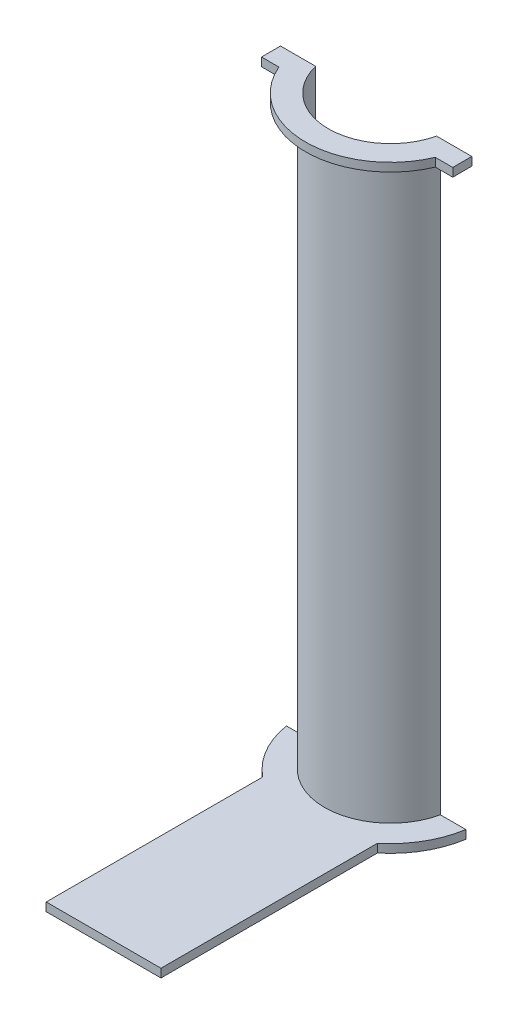
ISO-10303-21;
HEADER;
FILE_DESCRIPTION(('STEP AP214'),'2;1');
FILE_NAME('part.step','',(''),(''),'','','');
FILE_SCHEMA(('AUTOMOTIVE_DESIGN { 1 0 10303 214 1 1 1 1 }'));
ENDSEC;
DATA;
#1=APPLICATION_CONTEXT('core data for automotive mechanical design processes');
#2=APPLICATION_PROTOCOL_DEFINITION('international standard','automotive_design',2000,#1);
#3=PRODUCT_CONTEXT('',#1,'mechanical');
#4=PRODUCT('Part','Part','',(#3));
#5=PRODUCT_RELATED_PRODUCT_CATEGORY('part','',(#4));
#6=PRODUCT_DEFINITION_FORMATION('','',#4);
#7=PRODUCT_DEFINITION_CONTEXT('part definition',#1,'design');
#8=PRODUCT_DEFINITION('design','',#6,#7);
#9=PRODUCT_DEFINITION_SHAPE('','',#8);
#10=(LENGTH_UNIT() NAMED_UNIT(*) SI_UNIT(.MILLI.,.METRE.));
#11=(NAMED_UNIT(*) PLANE_ANGLE_UNIT() SI_UNIT($,.RADIAN.));
#12=(NAMED_UNIT(*) SI_UNIT($,.STERADIAN.) SOLID_ANGLE_UNIT());
#13=UNCERTAINTY_MEASURE_WITH_UNIT(LENGTH_MEASURE(1.E-05),#10,'distance_accuracy_value','');
#14=(GEOMETRIC_REPRESENTATION_CONTEXT(3) GLOBAL_UNCERTAINTY_ASSIGNED_CONTEXT((#13)) GLOBAL_UNIT_ASSIGNED_CONTEXT((#10,
#11,#12)) REPRESENTATION_CONTEXT('',''));
#15=CARTESIAN_POINT('',(0.,0.,0.));
#16=DIRECTION('',(0.,0.,1.));
#17=DIRECTION('',(1.,0.,0.));
#18=AXIS2_PLACEMENT_3D('',#15,#16,#17);
#19=CARTESIAN_POINT('',(-3.5559999999999,3.711630352635,-5.7911999999999));
#20=DIRECTION('',(0.,-1.,0.));
#21=DIRECTION('',(-1.,0.,0.));
#22=AXIS2_PLACEMENT_3D('',#19,#20,#21);
#23=CYLINDRICAL_SURFACE('',#22,0.349999999999993);
#24=CARTESIAN_POINT('',(-3.556,2.9306,-5.7911999999999));
#25=DIRECTION('',(0.,-1.,0.));
#26=DIRECTION('',(1.,0.,0.));
#27=AXIS2_PLACEMENT_3D('',#24,#25,#26);
#28=CIRCLE('',#27,0.350000000000009);
#29=CARTESIAN_POINT('',(-3.2143956089275,2.9306,-5.7149999999999));
#30=VERTEX_POINT('',#29);
#31=CARTESIAN_POINT('',(-3.8976043910725,2.9306,-5.7149999999999));
#32=VERTEX_POINT('',#31);
#33=EDGE_CURVE('E11',#30,#32,#28,.T.);
#34=ORIENTED_EDGE('',*,*,#33,.T.);
#35=DIRECTION('',(0.,-1.,0.));
#36=VECTOR('',#35,1.);
#37=CARTESIAN_POINT('',(-3.8976043910724,3.711630352635,-5.7149999999999));
#38=LINE('',#37,#36);
#39=CARTESIAN_POINT('',(-3.8976043910724,-0.1366,-5.7149999999999));
#40=VERTEX_POINT('',#39);
#41=EDGE_CURVE('E24',#32,#40,#38,.T.);
#42=ORIENTED_EDGE('',*,*,#41,.T.);
#43=CARTESIAN_POINT('',(-3.5559999999999,-0.1366,-5.7911999999999));
#44=DIRECTION('',(0.,-1.,0.));
#45=DIRECTION('',(1.,0.,0.));
#46=AXIS2_PLACEMENT_3D('',#43,#44,#45);
#47=CIRCLE('',#46,0.349999999999994);
#48=CARTESIAN_POINT('',(-3.2143956089274,-0.1366,-5.715));
#49=VERTEX_POINT('',#48);
#50=EDGE_CURVE('E260',#49,#40,#47,.T.);
#51=ORIENTED_EDGE('',*,*,#50,.F.);
#52=DIRECTION('',(0.,-1.,0.));
#53=VECTOR('',#52,1.);
#54=CARTESIAN_POINT('',(-3.2143956089274,3.711630352635,-5.715));
#55=LINE('',#54,#53);
#56=EDGE_CURVE('E257',#30,#49,#55,.T.);
#57=ORIENTED_EDGE('',*,*,#56,.F.);
#58=EDGE_LOOP('',(#34,#42,#51,#57));
#59=FACE_BOUND('',#58,.T.);
#60=ADVANCED_FACE('F17',(#59),#23,.T.);
#61=CARTESIAN_POINT('',(-3.0794537588018,-0.1816,-5.7149999999999));
#62=DIRECTION('',(0.,0.,-1.));
#63=DIRECTION('',(0.,1.,0.));
#64=AXIS2_PLACEMENT_3D('',#61,#62,#63);
#65=PLANE('',#64);
#66=DIRECTION('',(-1.,0.,0.));
#67=VECTOR('',#66,1.);
#68=CARTESIAN_POINT('',(-3.0794537588018,-0.1366,-5.7149999999999));
#69=LINE('',#68,#67);
#70=CARTESIAN_POINT('',(-3.0794537588018,-0.1366,-5.7149999999999));
#71=VERTEX_POINT('',#70);
#72=EDGE_CURVE('E254',#71,#49,#69,.T.);
#73=ORIENTED_EDGE('',*,*,#72,.F.);
#74=DIRECTION('',(0.,1.,0.));
#75=VECTOR('',#74,1.);
#76=CARTESIAN_POINT('',(-3.0794537588018,-0.1816,-5.7149999999999));
#77=LINE('',#76,#75);
#78=CARTESIAN_POINT('',(-3.0794537588018,-0.1816,-5.7149999999999));
#79=VERTEX_POINT('',#78);
#80=EDGE_CURVE('E251',#79,#71,#77,.T.);
#81=ORIENTED_EDGE('',*,*,#80,.F.);
#82=DIRECTION('',(-1.,0.,0.));
#83=VECTOR('',#82,1.);
#84=CARTESIAN_POINT('',(-3.0794537588018,-0.1816,-5.7149999999999));
#85=LINE('',#84,#83);
#86=CARTESIAN_POINT('',(-3.2349181412785,-0.1816,-5.715));
#87=VERTEX_POINT('',#86);
#88=EDGE_CURVE('E249',#79,#87,#85,.T.);
#89=ORIENTED_EDGE('',*,*,#88,.T.);
#90=DIRECTION('',(0.,-1.,0.));
#91=VECTOR('',#90,1.);
#92=CARTESIAN_POINT('',(-3.2349181412785,3.711630352635,-5.715));
#93=LINE('',#92,#91);
#94=CARTESIAN_POINT('',(-3.2349181412785,2.9756,-5.715));
#95=VERTEX_POINT('',#94);
#96=EDGE_CURVE('E246',#95,#87,#93,.T.);
#97=ORIENTED_EDGE('',*,*,#96,.F.);
#98=DIRECTION('',(-1.,0.,0.));
#99=VECTOR('',#98,1.);
#100=CARTESIAN_POINT('',(-3.2349181412785,2.9756,-5.715));
#101=LINE('',#100,#99);
#102=CARTESIAN_POINT('',(-3.0480000191799,2.9756,-5.7149999999999));
#103=VERTEX_POINT('',#102);
#104=EDGE_CURVE('E243',#103,#95,#101,.T.);
#105=ORIENTED_EDGE('',*,*,#104,.F.);
#106=DIRECTION('',(0.,-1.,0.));
#107=VECTOR('',#106,1.);
#108=CARTESIAN_POINT('',(-3.0480000191799,2.9756,-5.7149999999999));
#109=LINE('',#108,#107);
#110=CARTESIAN_POINT('',(-3.0480000191799,2.9306,-5.7149999999999));
#111=VERTEX_POINT('',#110);
#112=EDGE_CURVE('E241',#103,#111,#109,.T.);
#113=ORIENTED_EDGE('',*,*,#112,.T.);
#114=DIRECTION('',(-1.,0.,0.));
#115=VECTOR('',#114,1.);
#116=CARTESIAN_POINT('',(-3.2143956089275,2.9306,-5.7149999999999));
#117=LINE('',#116,#115);
#118=EDGE_CURVE('E148',#111,#30,#117,.T.);
#119=ORIENTED_EDGE('',*,*,#118,.T.);
#120=ORIENTED_EDGE('',*,*,#56,.T.);
#121=EDGE_LOOP('',(#73,#81,#89,#97,#105,#113,#119,#120));
#122=FACE_BOUND('',#121,.T.);
#123=ADVANCED_FACE('F288',(#122),#65,.T.);
#124=CARTESIAN_POINT('',(-3.5559999999999,-0.1816,-5.7911999999999));
#125=DIRECTION('',(0.,1.,0.));
#126=DIRECTION('',(1.,0.,0.));
#127=AXIS2_PLACEMENT_3D('',#124,#125,#126);
#128=CYLINDRICAL_SURFACE('',#127,0.482600000000033);
#129=CARTESIAN_POINT('',(-3.5559999999999,-0.1366,-5.7911999999999));
#130=DIRECTION('',(0.,1.,0.));
#131=DIRECTION('',(1.,0.,0.));
#132=AXIS2_PLACEMENT_3D('',#129,#130,#131);
#133=CIRCLE('',#132,0.482600000000033);
#134=CARTESIAN_POINT('',(-3.2511999999997,-0.1366,-5.4170346354886));
#135=VERTEX_POINT('',#134);
#136=EDGE_CURVE('E237',#135,#71,#133,.T.);
#137=ORIENTED_EDGE('',*,*,#136,.F.);
#138=DIRECTION('',(0.,1.,0.));
#139=VECTOR('',#138,1.);
#140=CARTESIAN_POINT('',(-3.2511999999997,-0.1816,-5.4170346354886));
#141=LINE('',#140,#139);
#142=CARTESIAN_POINT('',(-3.2511999999997,-0.1816,-5.4170346354886));
#143=VERTEX_POINT('',#142);
#144=EDGE_CURVE('E234',#143,#135,#141,.T.);
#145=ORIENTED_EDGE('',*,*,#144,.F.);
#146=CARTESIAN_POINT('',(-3.5559999999999,-0.1816,-5.7911999999999));
#147=DIRECTION('',(0.,1.,0.));
#148=DIRECTION('',(1.,0.,0.));
#149=AXIS2_PLACEMENT_3D('',#146,#147,#148);
#150=CIRCLE('',#149,0.482600000000033);
#151=EDGE_CURVE('E231',#143,#79,#150,.T.);
#152=ORIENTED_EDGE('',*,*,#151,.T.);
#153=ORIENTED_EDGE('',*,*,#80,.T.);
#154=EDGE_LOOP('',(#137,#145,#152,#153));
#155=FACE_BOUND('',#154,.T.);
#156=ADVANCED_FACE('F286',(#155),#128,.T.);
#157=CARTESIAN_POINT('',(-3.2511999999997,-0.1816,-5.4170346354886));
#158=DIRECTION('',(1.,0.,0.));
#159=DIRECTION('',(0.,-1.,0.));
#160=AXIS2_PLACEMENT_3D('',#157,#158,#159);
#161=PLANE('',#160);
#162=DIRECTION('',(0.,0.,-1.));
#163=VECTOR('',#162,1.);
#164=CARTESIAN_POINT('',(-3.2511999999997,-0.1366,-5.4170346354886));
#165=LINE('',#164,#163);
#166=CARTESIAN_POINT('',(-3.2511999999997,-0.1366,-4.2672000000001));
#167=VERTEX_POINT('',#166);
#168=EDGE_CURVE('E228',#167,#135,#165,.T.);
#169=ORIENTED_EDGE('',*,*,#168,.F.);
#170=DIRECTION('',(0.,1.,0.));
#171=VECTOR('',#170,1.);
#172=CARTESIAN_POINT('',(-3.2511999999997,-0.1816,-4.2672000000001));
#173=LINE('',#172,#171);
#174=CARTESIAN_POINT('',(-3.2511999999997,-0.1816,-4.2672000000001));
#175=VERTEX_POINT('',#174);
#176=EDGE_CURVE('E225',#175,#167,#173,.T.);
#177=ORIENTED_EDGE('',*,*,#176,.F.);
#178=DIRECTION('',(0.,0.,-1.));
#179=VECTOR('',#178,1.);
#180=CARTESIAN_POINT('',(-3.2511999999997,-0.1816,-5.4170346354886));
#181=LINE('',#180,#179);
#182=EDGE_CURVE('E222',#175,#143,#181,.T.);
#183=ORIENTED_EDGE('',*,*,#182,.T.);
#184=ORIENTED_EDGE('',*,*,#144,.T.);
#185=EDGE_LOOP('',(#169,#177,#183,#184));
#186=FACE_BOUND('',#185,.T.);
#187=ADVANCED_FACE('F282',(#186),#161,.T.);
#188=CARTESIAN_POINT('',(-3.2511999999997,-0.1816,-4.2672000000001));
#189=DIRECTION('',(0.,0.,1.));
#190=DIRECTION('',(0.,-1.,0.));
#191=AXIS2_PLACEMENT_3D('',#188,#189,#190);
#192=PLANE('',#191);
#193=DIRECTION('',(1.,0.,0.));
#194=VECTOR('',#193,1.);
#195=CARTESIAN_POINT('',(-3.2511999999997,-0.1366,-4.2672000000001));
#196=LINE('',#195,#194);
#197=CARTESIAN_POINT('',(-3.8608,-0.1366,-4.2672000000001));
#198=VERTEX_POINT('',#197);
#199=EDGE_CURVE('E219',#198,#167,#196,.T.);
#200=ORIENTED_EDGE('',*,*,#199,.F.);
#201=DIRECTION('',(0.,1.,0.));
#202=VECTOR('',#201,1.);
#203=CARTESIAN_POINT('',(-3.8608,-0.1816,-4.2672000000001));
#204=LINE('',#203,#202);
#205=CARTESIAN_POINT('',(-3.8608,-0.1816,-4.2672000000001));
#206=VERTEX_POINT('',#205);
#207=EDGE_CURVE('E216',#206,#198,#204,.T.);
#208=ORIENTED_EDGE('',*,*,#207,.F.);
#209=DIRECTION('',(1.,0.,0.));
#210=VECTOR('',#209,1.);
#211=CARTESIAN_POINT('',(-3.2511999999997,-0.1816,-4.2672000000001));
#212=LINE('',#211,#210);
#213=EDGE_CURVE('E213',#206,#175,#212,.T.);
#214=ORIENTED_EDGE('',*,*,#213,.T.);
#215=ORIENTED_EDGE('',*,*,#176,.T.);
#216=EDGE_LOOP('',(#200,#208,#214,#215));
#217=FACE_BOUND('',#216,.T.);
#218=ADVANCED_FACE('F280',(#217),#192,.T.);
#219=CARTESIAN_POINT('',(-3.8608,-0.1816,-4.2672000000001));
#220=DIRECTION('',(-1.,0.,0.));
#221=DIRECTION('',(0.,0.,1.));
#222=AXIS2_PLACEMENT_3D('',#219,#220,#221);
#223=PLANE('',#222);
#224=DIRECTION('',(0.,0.,1.));
#225=VECTOR('',#224,1.);
#226=CARTESIAN_POINT('',(-3.8608,-0.1366,-4.2672000000001));
#227=LINE('',#226,#225);
#228=CARTESIAN_POINT('',(-3.8608,-0.1366,-5.4170346354885));
#229=VERTEX_POINT('',#228);
#230=EDGE_CURVE('E210',#229,#198,#227,.T.);
#231=ORIENTED_EDGE('',*,*,#230,.F.);
#232=DIRECTION('',(0.,1.,0.));
#233=VECTOR('',#232,1.);
#234=CARTESIAN_POINT('',(-3.8608,-0.1816,-5.4170346354885));
#235=LINE('',#234,#233);
#236=CARTESIAN_POINT('',(-3.8608,-0.1816,-5.4170346354885));
#237=VERTEX_POINT('',#236);
#238=EDGE_CURVE('E207',#237,#229,#235,.T.);
#239=ORIENTED_EDGE('',*,*,#238,.F.);
#240=DIRECTION('',(0.,0.,1.));
#241=VECTOR('',#240,1.);
#242=CARTESIAN_POINT('',(-3.8608,-0.1816,-4.2672000000001));
#243=LINE('',#242,#241);
#244=EDGE_CURVE('E204',#237,#206,#243,.T.);
#245=ORIENTED_EDGE('',*,*,#244,.T.);
#246=ORIENTED_EDGE('',*,*,#207,.T.);
#247=EDGE_LOOP('',(#231,#239,#245,#246));
#248=FACE_BOUND('',#247,.T.);
#249=ADVANCED_FACE('F278',(#248),#223,.T.);
#250=CARTESIAN_POINT('',(-3.5559999999999,-0.1816,-5.7911999999999));
#251=DIRECTION('',(0.,1.,0.));
#252=DIRECTION('',(1.,0.,0.));
#253=AXIS2_PLACEMENT_3D('',#250,#251,#252);
#254=CYLINDRICAL_SURFACE('',#253,0.482600000000004);
#255=CARTESIAN_POINT('',(-3.5559999999999,-0.1366,-5.7911999999999));
#256=DIRECTION('',(0.,1.,0.));
#257=DIRECTION('',(1.,0.,0.));
#258=AXIS2_PLACEMENT_3D('',#255,#256,#257);
#259=CIRCLE('',#258,0.482600000000004);
#260=CARTESIAN_POINT('',(-4.032546241198,-0.1366,-5.7149999999999));
#261=VERTEX_POINT('',#260);
#262=EDGE_CURVE('E201',#261,#229,#259,.T.);
#263=ORIENTED_EDGE('',*,*,#262,.F.);
#264=DIRECTION('',(0.,1.,0.));
#265=VECTOR('',#264,1.);
#266=CARTESIAN_POINT('',(-4.032546241198,-0.1816,-5.7149999999999));
#267=LINE('',#266,#265);
#268=CARTESIAN_POINT('',(-4.032546241198,-0.1816,-5.7149999999999));
#269=VERTEX_POINT('',#268);
#270=EDGE_CURVE('E198',#269,#261,#267,.T.);
#271=ORIENTED_EDGE('',*,*,#270,.F.);
#272=CARTESIAN_POINT('',(-3.5559999999999,-0.1816,-5.7911999999999));
#273=DIRECTION('',(0.,1.,0.));
#274=DIRECTION('',(1.,0.,0.));
#275=AXIS2_PLACEMENT_3D('',#272,#273,#274);
#276=CIRCLE('',#275,0.482600000000004);
#277=EDGE_CURVE('E195',#269,#237,#276,.T.);
#278=ORIENTED_EDGE('',*,*,#277,.T.);
#279=ORIENTED_EDGE('',*,*,#238,.T.);
#280=EDGE_LOOP('',(#263,#271,#278,#279));
#281=FACE_BOUND('',#280,.T.);
#282=ADVANCED_FACE('F270',(#281),#254,.T.);
#283=CARTESIAN_POINT('',(-3.8976043910724,-0.1816,-5.7149999999999));
#284=DIRECTION('',(0.,0.,-1.));
#285=DIRECTION('',(0.,1.,0.));
#286=AXIS2_PLACEMENT_3D('',#283,#284,#285);
#287=PLANE('',#286);
#288=DIRECTION('',(-1.,0.,0.));
#289=VECTOR('',#288,1.);
#290=CARTESIAN_POINT('',(-3.8976043910724,-0.1366,-5.7149999999999));
#291=LINE('',#290,#289);
#292=EDGE_CURVE('E192',#40,#261,#291,.T.);
#293=ORIENTED_EDGE('',*,*,#292,.F.);
#294=ORIENTED_EDGE('',*,*,#41,.F.);
#295=DIRECTION('',(-1.,0.,0.));
#296=VECTOR('',#295,1.);
#297=CARTESIAN_POINT('',(-4.064,2.9306,-5.7149999999999));
#298=LINE('',#297,#296);
#299=CARTESIAN_POINT('',(-4.064,2.9306,-5.7149999999999));
#300=VERTEX_POINT('',#299);
#301=EDGE_CURVE('E190',#32,#300,#298,.T.);
#302=ORIENTED_EDGE('',*,*,#301,.T.);
#303=DIRECTION('',(0.,-1.,0.));
#304=VECTOR('',#303,1.);
#305=CARTESIAN_POINT('',(-4.064,2.9756,-5.7149999999999));
#306=LINE('',#305,#304);
#307=CARTESIAN_POINT('',(-4.064,2.9756,-5.7149999999999));
#308=VERTEX_POINT('',#307);
#309=EDGE_CURVE('E187',#308,#300,#306,.T.);
#310=ORIENTED_EDGE('',*,*,#309,.F.);
#311=DIRECTION('',(-1.,0.,0.));
#312=VECTOR('',#311,1.);
#313=CARTESIAN_POINT('',(-3.8976043910724,2.9756,-5.7149999999999));
#314=LINE('',#313,#312);
#315=CARTESIAN_POINT('',(-3.8770818587213,2.9756,-5.7149999999999));
#316=VERTEX_POINT('',#315);
#317=EDGE_CURVE('E184',#316,#308,#314,.T.);
#318=ORIENTED_EDGE('',*,*,#317,.F.);
#319=DIRECTION('',(0.,-1.,0.));
#320=VECTOR('',#319,1.);
#321=CARTESIAN_POINT('',(-3.8770818587213,3.711630352635,-5.7149999999999));
#322=LINE('',#321,#320);
#323=CARTESIAN_POINT('',(-3.8770818587213,-0.1816,-5.7149999999999));
#324=VERTEX_POINT('',#323);
#325=EDGE_CURVE('E182',#316,#324,#322,.T.);
#326=ORIENTED_EDGE('',*,*,#325,.T.);
#327=DIRECTION('',(-1.,0.,0.));
#328=VECTOR('',#327,1.);
#329=CARTESIAN_POINT('',(-3.8976043910724,-0.1816,-5.7149999999999));
#330=LINE('',#329,#328);
#331=EDGE_CURVE('E179',#324,#269,#330,.T.);
#332=ORIENTED_EDGE('',*,*,#331,.T.);
#333=ORIENTED_EDGE('',*,*,#270,.T.);
#334=EDGE_LOOP('',(#293,#294,#302,#310,#318,#326,#332,#333));
#335=FACE_BOUND('',#334,.T.);
#336=ADVANCED_FACE('F266',(#335),#287,.T.);
#337=CARTESIAN_POINT('',(-3.5559999999999,-0.1816,-5.7911999999999));
#338=DIRECTION('',(0.,1.,0.));
#339=DIRECTION('',(1.,0.,0.));
#340=AXIS2_PLACEMENT_3D('',#337,#338,#339);
#341=PLANE('',#340);
#342=ORIENTED_EDGE('',*,*,#331,.F.);
#343=CARTESIAN_POINT('',(-3.5559999999999,-0.1816,-5.7911999999999));
#344=DIRECTION('',(0.,-1.,0.));
#345=DIRECTION('',(1.,0.,0.));
#346=AXIS2_PLACEMENT_3D('',#343,#344,#345);
#347=CIRCLE('',#346,0.329999999999992);
#348=EDGE_CURVE('E176',#87,#324,#347,.T.);
#349=ORIENTED_EDGE('',*,*,#348,.F.);
#350=ORIENTED_EDGE('',*,*,#88,.F.);
#351=ORIENTED_EDGE('',*,*,#151,.F.);
#352=ORIENTED_EDGE('',*,*,#182,.F.);
#353=ORIENTED_EDGE('',*,*,#213,.F.);
#354=ORIENTED_EDGE('',*,*,#244,.F.);
#355=ORIENTED_EDGE('',*,*,#277,.F.);
#356=EDGE_LOOP('',(#342,#349,#350,#351,#352,#353,#354,#355));
#357=FACE_BOUND('',#356,.T.);
#358=ADVANCED_FACE('F273',(#357),#341,.F.);
#359=CARTESIAN_POINT('',(-3.5559999999999,-0.1366,-5.7911999999999));
#360=DIRECTION('',(0.,1.,0.));
#361=DIRECTION('',(1.,0.,0.));
#362=AXIS2_PLACEMENT_3D('',#359,#360,#361);
#363=PLANE('',#362);
#364=ORIENTED_EDGE('',*,*,#50,.T.);
#365=ORIENTED_EDGE('',*,*,#292,.T.);
#366=ORIENTED_EDGE('',*,*,#262,.T.);
#367=ORIENTED_EDGE('',*,*,#230,.T.);
#368=ORIENTED_EDGE('',*,*,#199,.T.);
#369=ORIENTED_EDGE('',*,*,#168,.T.);
#370=ORIENTED_EDGE('',*,*,#136,.T.);
#371=ORIENTED_EDGE('',*,*,#72,.T.);
#372=EDGE_LOOP('',(#364,#365,#366,#367,#368,#369,#370,#371));
#373=FACE_BOUND('',#372,.T.);
#374=ADVANCED_FACE('F265',(#373),#363,.T.);
#375=CARTESIAN_POINT('',(-3.5559999999999,3.711630352635,-5.7911999999999));
#376=DIRECTION('',(0.,-1.,0.));
#377=DIRECTION('',(-1.,0.,0.));
#378=AXIS2_PLACEMENT_3D('',#375,#376,#377);
#379=CYLINDRICAL_SURFACE('',#378,0.329999999999992);
#380=CARTESIAN_POINT('',(-3.5559999999999,2.9756,-5.7911999999999));
#381=DIRECTION('',(0.,-1.,0.));
#382=DIRECTION('',(1.,0.,0.));
#383=AXIS2_PLACEMENT_3D('',#380,#381,#382);
#384=CIRCLE('',#383,0.329999999999992);
#385=EDGE_CURVE('E173',#95,#316,#384,.T.);
#386=ORIENTED_EDGE('',*,*,#385,.F.);
#387=ORIENTED_EDGE('',*,*,#96,.T.);
#388=ORIENTED_EDGE('',*,*,#348,.T.);
#389=ORIENTED_EDGE('',*,*,#325,.F.);
#390=EDGE_LOOP('',(#386,#387,#388,#389));
#391=FACE_BOUND('',#390,.T.);
#392=ADVANCED_FACE('F307',(#391),#379,.F.);
#393=CARTESIAN_POINT('',(4.064,2.9756,-5.7911999999999));
#394=DIRECTION('',(0.,1.,0.));
#395=DIRECTION('',(1.,0.,0.));
#396=AXIS2_PLACEMENT_3D('',#393,#394,#395);
#397=PLANE('',#396);
#398=ORIENTED_EDGE('',*,*,#104,.T.);
#399=ORIENTED_EDGE('',*,*,#385,.T.);
#400=ORIENTED_EDGE('',*,*,#317,.T.);
#401=DIRECTION('',(0.,0.,1.));
#402=VECTOR('',#401,1.);
#403=CARTESIAN_POINT('',(-4.064,2.9756,-5.6139000331631));
#404=LINE('',#403,#402);
#405=CARTESIAN_POINT('',(-4.064,2.9756,-5.6139000331631));
#406=VERTEX_POINT('',#405);
#407=EDGE_CURVE('E171',#308,#406,#404,.T.);
#408=ORIENTED_EDGE('',*,*,#407,.T.);
#409=DIRECTION('',(1.,0.,0.));
#410=VECTOR('',#409,1.);
#411=CARTESIAN_POINT('',(-4.064,2.9756,-5.6139000331631));
#412=LINE('',#411,#410);
#413=CARTESIAN_POINT('',(-3.9713530068552,2.9756,-5.6139000331631));
#414=VERTEX_POINT('',#413);
#415=EDGE_CURVE('E169',#406,#414,#412,.T.);
#416=ORIENTED_EDGE('',*,*,#415,.T.);
#417=CARTESIAN_POINT('',(-3.556,2.9756,-5.7911999999999));
#418=DIRECTION('',(0.,1.,0.));
#419=DIRECTION('',(1.,0.,0.));
#420=AXIS2_PLACEMENT_3D('',#417,#418,#419);
#421=CIRCLE('',#420,0.451611999999999);
#422=CARTESIAN_POINT('',(-3.1406469931448,2.9756,-5.6139000331631));
#423=VERTEX_POINT('',#422);
#424=EDGE_CURVE('E167',#414,#423,#421,.T.);
#425=ORIENTED_EDGE('',*,*,#424,.T.);
#426=DIRECTION('',(1.,0.,0.));
#427=VECTOR('',#426,1.);
#428=CARTESIAN_POINT('',(-3.1406469931448,2.9756,-5.6139000331631));
#429=LINE('',#428,#427);
#430=CARTESIAN_POINT('',(-3.0480000191799,2.9756,-5.6139000331631));
#431=VERTEX_POINT('',#430);
#432=EDGE_CURVE('E165',#423,#431,#429,.T.);
#433=ORIENTED_EDGE('',*,*,#432,.T.);
#434=DIRECTION('',(0.,0.,-1.));
#435=VECTOR('',#434,1.);
#436=CARTESIAN_POINT('',(-3.0480000191799,2.9756,-5.6139000331631));
#437=LINE('',#436,#435);
#438=EDGE_CURVE('E144',#431,#103,#437,.T.);
#439=ORIENTED_EDGE('',*,*,#438,.T.);
#440=EDGE_LOOP('',(#398,#399,#400,#408,#416,#425,#433,#439));
#441=FACE_BOUND('',#440,.T.);
#442=ADVANCED_FACE('F290',(#441),#397,.T.);
#443=CARTESIAN_POINT('',(-4.064,2.9756,-5.6139000331631));
#444=DIRECTION('',(1.,0.,0.));
#445=DIRECTION('',(0.,-1.,0.));
#446=AXIS2_PLACEMENT_3D('',#443,#444,#445);
#447=PLANE('',#446);
#448=DIRECTION('',(0.,0.,1.));
#449=VECTOR('',#448,1.);
#450=CARTESIAN_POINT('',(-4.064,2.9306,-5.6139000331631));
#451=LINE('',#450,#449);
#452=CARTESIAN_POINT('',(-4.064,2.9306,-5.6139000331631));
#453=VERTEX_POINT('',#452);
#454=EDGE_CURVE('E162',#300,#453,#451,.T.);
#455=ORIENTED_EDGE('',*,*,#454,.T.);
#456=DIRECTION('',(0.,-1.,0.));
#457=VECTOR('',#456,1.);
#458=CARTESIAN_POINT('',(-4.064,2.9756,-5.6139000331631));
#459=LINE('',#458,#457);
#460=EDGE_CURVE('E159',#406,#453,#459,.T.);
#461=ORIENTED_EDGE('',*,*,#460,.F.);
#462=ORIENTED_EDGE('',*,*,#407,.F.);
#463=ORIENTED_EDGE('',*,*,#309,.T.);
#464=EDGE_LOOP('',(#455,#461,#462,#463));
#465=FACE_BOUND('',#464,.T.);
#466=ADVANCED_FACE('F304',(#465),#447,.F.);
#467=CARTESIAN_POINT('',(-4.064,2.9756,-5.6139000331631));
#468=DIRECTION('',(0.,0.,-1.));
#469=DIRECTION('',(0.,1.,0.));
#470=AXIS2_PLACEMENT_3D('',#467,#468,#469);
#471=PLANE('',#470);
#472=DIRECTION('',(1.,0.,0.));
#473=VECTOR('',#472,1.);
#474=CARTESIAN_POINT('',(-4.064,2.9306,-5.6139000331631));
#475=LINE('',#474,#473);
#476=CARTESIAN_POINT('',(-3.9713530068552,2.9306,-5.6139000331631));
#477=VERTEX_POINT('',#476);
#478=EDGE_CURVE('E157',#453,#477,#475,.T.);
#479=ORIENTED_EDGE('',*,*,#478,.T.);
#480=DIRECTION('',(0.,-1.,0.));
#481=VECTOR('',#480,1.);
#482=CARTESIAN_POINT('',(-3.9713530068552,2.9756,-5.6139000331631));
#483=LINE('',#482,#481);
#484=EDGE_CURVE('E154',#414,#477,#483,.T.);
#485=ORIENTED_EDGE('',*,*,#484,.F.);
#486=ORIENTED_EDGE('',*,*,#415,.F.);
#487=ORIENTED_EDGE('',*,*,#460,.T.);
#488=EDGE_LOOP('',(#479,#485,#486,#487));
#489=FACE_BOUND('',#488,.T.);
#490=ADVANCED_FACE('F299',(#489),#471,.F.);
#491=CARTESIAN_POINT('',(-3.556,2.9756,-5.7911999999999));
#492=DIRECTION('',(0.,-1.,0.));
#493=DIRECTION('',(-1.,0.,0.));
#494=AXIS2_PLACEMENT_3D('',#491,#492,#493);
#495=CYLINDRICAL_SURFACE('',#494,0.451611999999999);
#496=CARTESIAN_POINT('',(-3.556,2.9306,-5.7911999999999));
#497=DIRECTION('',(0.,1.,0.));
#498=DIRECTION('',(1.,0.,0.));
#499=AXIS2_PLACEMENT_3D('',#496,#497,#498);
#500=CIRCLE('',#499,0.451611999999999);
#501=CARTESIAN_POINT('',(-3.1406469931448,2.9306,-5.6139000331631));
#502=VERTEX_POINT('',#501);
#503=EDGE_CURVE('E152',#477,#502,#500,.T.);
#504=ORIENTED_EDGE('',*,*,#503,.T.);
#505=DIRECTION('',(0.,-1.,0.));
#506=VECTOR('',#505,1.);
#507=CARTESIAN_POINT('',(-3.1406469931448,2.9756,-5.6139000331631));
#508=LINE('',#507,#506);
#509=EDGE_CURVE('E133',#423,#502,#508,.T.);
#510=ORIENTED_EDGE('',*,*,#509,.F.);
#511=ORIENTED_EDGE('',*,*,#424,.F.);
#512=ORIENTED_EDGE('',*,*,#484,.T.);
#513=EDGE_LOOP('',(#504,#510,#511,#512));
#514=FACE_BOUND('',#513,.T.);
#515=ADVANCED_FACE('F294',(#514),#495,.T.);
#516=CARTESIAN_POINT('',(-3.1406469931448,2.9756,-5.6139000331631));
#517=DIRECTION('',(0.,0.,-1.));
#518=DIRECTION('',(0.,1.,0.));
#519=AXIS2_PLACEMENT_3D('',#516,#517,#518);
#520=PLANE('',#519);
#521=DIRECTION('',(1.,0.,0.));
#522=VECTOR('',#521,1.);
#523=CARTESIAN_POINT('',(-3.1406469931448,2.9306,-5.6139000331631));
#524=LINE('',#523,#522);
#525=CARTESIAN_POINT('',(-3.0480000191799,2.9306,-5.6139000331631));
#526=VERTEX_POINT('',#525);
#527=EDGE_CURVE('E127',#502,#526,#524,.T.);
#528=ORIENTED_EDGE('',*,*,#527,.T.);
#529=DIRECTION('',(0.,-1.,0.));
#530=VECTOR('',#529,1.);
#531=CARTESIAN_POINT('',(-3.0480000191799,2.9756,-5.6139000331631));
#532=LINE('',#531,#530);
#533=EDGE_CURVE('E131',#431,#526,#532,.T.);
#534=ORIENTED_EDGE('',*,*,#533,.F.);
#535=ORIENTED_EDGE('',*,*,#432,.F.);
#536=ORIENTED_EDGE('',*,*,#509,.T.);
#537=EDGE_LOOP('',(#528,#534,#535,#536));
#538=FACE_BOUND('',#537,.T.);
#539=ADVANCED_FACE('F129',(#538),#520,.F.);
#540=CARTESIAN_POINT('',(-3.0480000191799,2.9756,-5.6139000331631));
#541=DIRECTION('',(-1.,0.,0.));
#542=DIRECTION('',(0.,1.,0.));
#543=AXIS2_PLACEMENT_3D('',#540,#541,#542);
#544=PLANE('',#543);
#545=DIRECTION('',(0.,0.,-1.));
#546=VECTOR('',#545,1.);
#547=CARTESIAN_POINT('',(-3.0480000191799,2.9306,-5.6139000331631));
#548=LINE('',#547,#546);
#549=EDGE_CURVE('E142',#526,#111,#548,.T.);
#550=ORIENTED_EDGE('',*,*,#549,.T.);
#551=ORIENTED_EDGE('',*,*,#112,.F.);
#552=ORIENTED_EDGE('',*,*,#438,.F.);
#553=ORIENTED_EDGE('',*,*,#533,.T.);
#554=EDGE_LOOP('',(#550,#551,#552,#553));
#555=FACE_BOUND('',#554,.T.);
#556=ADVANCED_FACE('F140',(#555),#544,.F.);
#557=CARTESIAN_POINT('',(-3.556,2.9306,-5.7911999999999));
#558=DIRECTION('',(0.,1.,0.));
#559=DIRECTION('',(1.,0.,0.));
#560=AXIS2_PLACEMENT_3D('',#557,#558,#559);
#561=PLANE('',#560);
#562=ORIENTED_EDGE('',*,*,#33,.F.);
#563=ORIENTED_EDGE('',*,*,#118,.F.);
#564=ORIENTED_EDGE('',*,*,#549,.F.);
#565=ORIENTED_EDGE('',*,*,#527,.F.);
#566=ORIENTED_EDGE('',*,*,#503,.F.);
#567=ORIENTED_EDGE('',*,*,#478,.F.);
#568=ORIENTED_EDGE('',*,*,#454,.F.);
#569=ORIENTED_EDGE('',*,*,#301,.F.);
#570=EDGE_LOOP('',(#562,#563,#564,#565,#566,#567,#568,#569));
#571=FACE_BOUND('',#570,.T.);
#572=ADVANCED_FACE('F146',(#571),#561,.F.);
#573=CLOSED_SHELL('',(#60,#123,#156,#187,#218,#249,#282,#336,#358,#374,#392,#442,#466,#490,#515,
#539,#556,#572));
#574=MANIFOLD_SOLID_BREP('B1',#573);
#575=ADVANCED_BREP_SHAPE_REPRESENTATION('',(#18,#574),#14);
#576=SHAPE_DEFINITION_REPRESENTATION(#9,#575);
ENDSEC;
END-ISO-10303-21;
